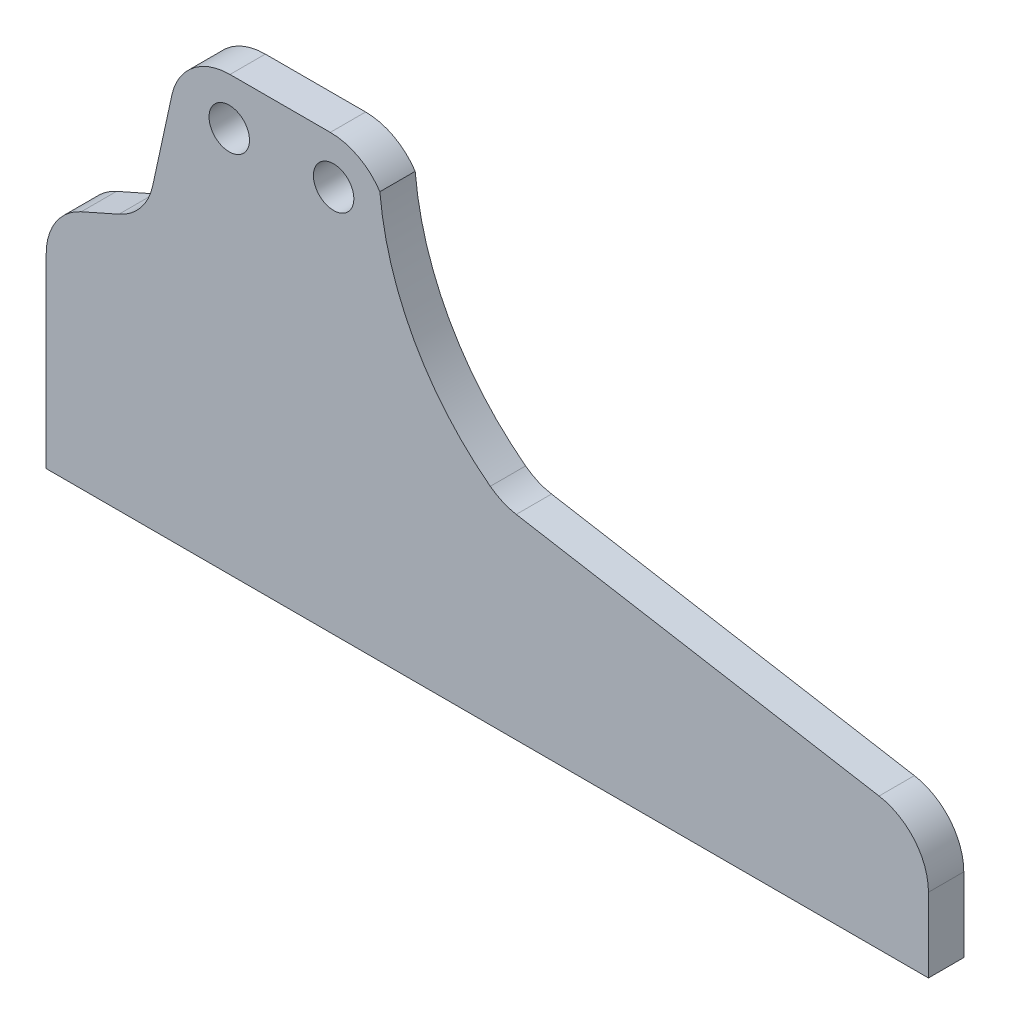
ISO-10303-21;
HEADER;
FILE_DESCRIPTION(('STEP AP214'),'2;1');
FILE_NAME('part.step','',(''),(''),'','','');
FILE_SCHEMA(('AUTOMOTIVE_DESIGN { 1 0 10303 214 1 1 1 1 }'));
ENDSEC;
DATA;
#1=APPLICATION_CONTEXT('core data for automotive mechanical design processes');
#2=APPLICATION_PROTOCOL_DEFINITION('international standard','automotive_design',2000,#1);
#3=PRODUCT_CONTEXT('',#1,'mechanical');
#4=PRODUCT('Part','Part','',(#3));
#5=PRODUCT_RELATED_PRODUCT_CATEGORY('part','',(#4));
#6=PRODUCT_DEFINITION_FORMATION('','',#4);
#7=PRODUCT_DEFINITION_CONTEXT('part definition',#1,'design');
#8=PRODUCT_DEFINITION('design','',#6,#7);
#9=PRODUCT_DEFINITION_SHAPE('','',#8);
#10=(LENGTH_UNIT() NAMED_UNIT(*) SI_UNIT(.MILLI.,.METRE.));
#11=(NAMED_UNIT(*) PLANE_ANGLE_UNIT() SI_UNIT($,.RADIAN.));
#12=(NAMED_UNIT(*) SI_UNIT($,.STERADIAN.) SOLID_ANGLE_UNIT());
#13=UNCERTAINTY_MEASURE_WITH_UNIT(LENGTH_MEASURE(1.E-05),#10,'distance_accuracy_value','');
#14=(GEOMETRIC_REPRESENTATION_CONTEXT(3) GLOBAL_UNCERTAINTY_ASSIGNED_CONTEXT((#13)) GLOBAL_UNIT_ASSIGNED_CONTEXT((#10,
#11,#12)) REPRESENTATION_CONTEXT('',''));
#15=CARTESIAN_POINT('',(0.,0.,0.));
#16=DIRECTION('',(0.,0.,1.));
#17=DIRECTION('',(1.,0.,0.));
#18=AXIS2_PLACEMENT_3D('',#15,#16,#17);
#19=CARTESIAN_POINT('',(-64.4109755332574,-10.7309621392567,5.99999999999999));
#20=DIRECTION('',(0.,0.,-1.));
#21=DIRECTION('',(-1.,0.,0.));
#22=AXIS2_PLACEMENT_3D('',#19,#20,#21);
#23=PLANE('',#22);
#24=DIRECTION('',(0.,1.,0.));
#25=VECTOR('',#24,1.);
#26=CARTESIAN_POINT('',(75.4762445355646,-29.743767833365,5.99999999999999));
#27=LINE('',#26,#25);
#28=CARTESIAN_POINT('',(75.4762445355646,-42.3626551440103,5.99999999999999));
#29=VERTEX_POINT('',#28);
#30=CARTESIAN_POINT('',(75.4762445355646,-29.743767833365,5.99999999999999));
#31=VERTEX_POINT('',#30);
#32=EDGE_CURVE('E193',#29,#31,#27,.T.);
#33=ORIENTED_EDGE('',*,*,#32,.T.);
#34=CARTESIAN_POINT('',(65.3686203518533,-29.743767833365,5.99999999999999));
#35=DIRECTION('',(0.,0.,1.));
#36=DIRECTION('',(-1.,0.,0.));
#37=AXIS2_PLACEMENT_3D('',#34,#35,#36);
#38=CIRCLE('',#37,10.1076241837114);
#39=CARTESIAN_POINT('',(67.0838116667973,-19.7827344837427,5.99999999999999));
#40=VERTEX_POINT('',#39);
#41=EDGE_CURVE('E111',#31,#40,#38,.T.);
#42=ORIENTED_EDGE('',*,*,#41,.T.);
#43=DIRECTION('',(-0.985497003902725,0.169692826303154,0.));
#44=VECTOR('',#43,1.);
#45=CARTESIAN_POINT('',(5.44351022759878,-9.16888489924571,5.99999999999999));
#46=LINE('',#45,#44);
#47=CARTESIAN_POINT('',(5.44351022759878,-9.16888489924571,5.99999999999999));
#48=VERTEX_POINT('',#47);
#49=EDGE_CURVE('E226',#40,#48,#46,.T.);
#50=ORIENTED_EDGE('',*,*,#49,.T.);
#51=CARTESIAN_POINT('',(7.15870154254287,0.792148450376581,5.99999999999999));
#52=DIRECTION('',(0.,0.,-1.));
#53=DIRECTION('',(1.,0.,0.));
#54=AXIS2_PLACEMENT_3D('',#51,#52,#53);
#55=CIRCLE('',#54,10.1076241837114);
#56=CARTESIAN_POINT('',(1.02946853054367,-7.24505064655802,5.99999999999999));
#57=VERTEX_POINT('',#56);
#58=EDGE_CURVE('E245',#48,#57,#55,.T.);
#59=ORIENTED_EDGE('',*,*,#58,.T.);
#60=CARTESIAN_POINT('',(30.2212864779,31.0338746912543,5.99999999999999));
#61=DIRECTION('',(0.,0.,-1.));
#62=DIRECTION('',(1.,0.,0.));
#63=AXIS2_PLACEMENT_3D('',#60,#61,#62);
#64=CIRCLE('',#63,48.1397793938589);
#65=CARTESIAN_POINT('',(-17.7251838120541,26.7240780807459,5.99999999999999));
#66=VERTEX_POINT('',#65);
#67=EDGE_CURVE('E242',#57,#66,#64,.T.);
#68=ORIENTED_EDGE('',*,*,#67,.T.);
#69=CARTESIAN_POINT('',(-26.1484310606989,21.1372209653951,5.99999999999999));
#70=DIRECTION('',(0.,0.,1.));
#71=DIRECTION('',(-1.,0.,0.));
#72=AXIS2_PLACEMENT_3D('',#69,#70,#71);
#73=CIRCLE('',#72,10.1076241837114);
#74=CARTESIAN_POINT('',(-26.1484310606989,31.2448451491065,5.99999999999999));
#75=VERTEX_POINT('',#74);
#76=EDGE_CURVE('E244',#66,#75,#73,.T.);
#77=ORIENTED_EDGE('',*,*,#76,.T.);
#78=DIRECTION('',(-1.,0.,0.));
#79=VECTOR('',#78,1.);
#80=CARTESIAN_POINT('',(-43.1863208249576,31.2448451491065,5.99999999999999));
#81=LINE('',#80,#79);
#82=CARTESIAN_POINT('',(-43.1863208249576,31.2448451491065,5.99999999999999));
#83=VERTEX_POINT('',#82);
#84=EDGE_CURVE('E247',#75,#83,#81,.T.);
#85=ORIENTED_EDGE('',*,*,#84,.T.);
#86=CARTESIAN_POINT('',(-43.1863208249577,21.1372209653951,5.99999999999999));
#87=DIRECTION('',(0.,0.,1.));
#88=DIRECTION('',(-1.,0.,0.));
#89=AXIS2_PLACEMENT_3D('',#86,#87,#88);
#90=CIRCLE('',#89,10.1076241837114);
#91=CARTESIAN_POINT('',(-53.0632522726949,23.2843799757727,5.99999999999999));
#92=VERTEX_POINT('',#91);
#93=EDGE_CURVE('E253',#83,#92,#90,.T.);
#94=ORIENTED_EDGE('',*,*,#93,.T.);
#95=DIRECTION('',(-0.212429644331044,-0.977176363922801,0.));
#96=VECTOR('',#95,1.);
#97=CARTESIAN_POINT('',(-56.3270893420715,8.27072945664082,5.99999999999999));
#98=LINE('',#97,#96);
#99=CARTESIAN_POINT('',(-56.3270893420715,8.27072945664081,5.99999999999999));
#100=VERTEX_POINT('',#99);
#101=EDGE_CURVE('E255',#92,#100,#98,.T.);
#102=ORIENTED_EDGE('',*,*,#101,.T.);
#103=CARTESIAN_POINT('',(-66.0988529812995,10.3950258999512,5.99999999999999));
#104=DIRECTION('',(0.,0.,-1.));
#105=DIRECTION('',(1.,0.,0.));
#106=AXIS2_PLACEMENT_3D('',#103,#104,#105);
#107=CIRCLE('',#106,10.);
#108=CARTESIAN_POINT('',(-62.049591398579,1.25153200348557,5.99999999999999));
#109=VERTEX_POINT('',#108);
#110=EDGE_CURVE('E257',#100,#109,#107,.T.);
#111=ORIENTED_EDGE('',*,*,#110,.T.);
#112=DIRECTION('',(-0.914349389646562,-0.404926158272049,0.));
#113=VECTOR('',#112,1.);
#114=CARTESIAN_POINT('',(-68.4602371159778,-1.58746824279103,5.99999999999999));
#115=LINE('',#114,#113);
#116=CARTESIAN_POINT('',(-68.4602371159778,-1.58746824279103,5.99999999999999));
#117=VERTEX_POINT('',#116);
#118=EDGE_CURVE('E148',#109,#117,#115,.T.);
#119=ORIENTED_EDGE('',*,*,#118,.T.);
#120=CARTESIAN_POINT('',(-64.4109755332574,-10.7309621392567,5.99999999999999));
#121=DIRECTION('',(0.,0.,1.));
#122=DIRECTION('',(-1.,0.,0.));
#123=AXIS2_PLACEMENT_3D('',#120,#121,#122);
#124=CIRCLE('',#123,10.);
#125=CARTESIAN_POINT('',(-74.4109755332574,-10.7309621392567,5.99999999999999));
#126=VERTEX_POINT('',#125);
#127=EDGE_CURVE('E142',#117,#126,#124,.T.);
#128=ORIENTED_EDGE('',*,*,#127,.T.);
#129=DIRECTION('',(0.,-1.,0.));
#130=VECTOR('',#129,1.);
#131=CARTESIAN_POINT('',(-74.4109755332574,-42.3626551440103,5.99999999999999));
#132=LINE('',#131,#130);
#133=CARTESIAN_POINT('',(-74.4109755332574,-42.3626551440103,5.99999999999999));
#134=VERTEX_POINT('',#133);
#135=EDGE_CURVE('E146',#126,#134,#132,.T.);
#136=ORIENTED_EDGE('',*,*,#135,.T.);
#137=DIRECTION('',(1.,0.,0.));
#138=VECTOR('',#137,1.);
#139=CARTESIAN_POINT('',(75.4762445355646,-42.3626551440103,5.99999999999999));
#140=LINE('',#139,#138);
#141=EDGE_CURVE('E50',#134,#29,#140,.T.);
#142=ORIENTED_EDGE('',*,*,#141,.T.);
#143=EDGE_LOOP('',(#33,#42,#50,#59,#68,#77,#85,#94,#102,#111,#119,#128,#136,#142));
#144=FACE_BOUND('',#143,.T.);
#145=CARTESIAN_POINT('',(-25.5822377150512,23.471115745213,5.99999999999999));
#146=DIRECTION('',(0.,0.,1.));
#147=DIRECTION('',(1.,0.,0.));
#148=AXIS2_PLACEMENT_3D('',#145,#146,#147);
#149=CIRCLE('',#148,3.43553548537648);
#150=CARTESIAN_POINT('',(-22.1467022296747,23.471115745213,5.99999999999999));
#151=VERTEX_POINT('',#150);
#152=EDGE_CURVE('E170',#151,#151,#149,.T.);
#153=ORIENTED_EDGE('',*,*,#152,.F.);
#154=EDGE_LOOP('',(#153));
#155=FACE_BOUND('',#154,.T.);
#156=CARTESIAN_POINT('',(-43.3160579176833,23.2281867013413,5.99999999999999));
#157=DIRECTION('',(0.,0.,1.));
#158=DIRECTION('',(1.,0.,0.));
#159=AXIS2_PLACEMENT_3D('',#156,#157,#158);
#160=CIRCLE('',#159,3.43553548537648);
#161=CARTESIAN_POINT('',(-39.8805224323068,23.2281867013413,5.99999999999999));
#162=VERTEX_POINT('',#161);
#163=EDGE_CURVE('E298',#162,#162,#160,.T.);
#164=ORIENTED_EDGE('',*,*,#163,.F.);
#165=EDGE_LOOP('',(#164));
#166=FACE_BOUND('',#165,.T.);
#167=ADVANCED_FACE('F33',(#144,#155,#166),#23,.F.);
#168=CARTESIAN_POINT('',(-64.4109755332574,-10.7309621392567,0.));
#169=DIRECTION('',(0.,0.,-1.));
#170=DIRECTION('',(-1.,0.,0.));
#171=AXIS2_PLACEMENT_3D('',#168,#169,#170);
#172=PLANE('',#171);
#173=CARTESIAN_POINT('',(-25.5822377150512,23.471115745213,0.));
#174=DIRECTION('',(0.,0.,1.));
#175=DIRECTION('',(1.,0.,0.));
#176=AXIS2_PLACEMENT_3D('',#173,#174,#175);
#177=CIRCLE('',#176,3.43553548537648);
#178=CARTESIAN_POINT('',(-22.1467022296747,23.471115745213,0.));
#179=VERTEX_POINT('',#178);
#180=EDGE_CURVE('E303',#179,#179,#177,.T.);
#181=ORIENTED_EDGE('',*,*,#180,.T.);
#182=EDGE_LOOP('',(#181));
#183=FACE_BOUND('',#182,.T.);
#184=DIRECTION('',(0.,1.,0.));
#185=VECTOR('',#184,1.);
#186=CARTESIAN_POINT('',(75.4762445355646,-29.743767833365,0.));
#187=LINE('',#186,#185);
#188=CARTESIAN_POINT('',(75.4762445355646,-42.3626551440103,0.));
#189=VERTEX_POINT('',#188);
#190=CARTESIAN_POINT('',(75.4762445355646,-29.743767833365,0.));
#191=VERTEX_POINT('',#190);
#192=EDGE_CURVE('E166',#189,#191,#187,.T.);
#193=ORIENTED_EDGE('',*,*,#192,.F.);
#194=DIRECTION('',(1.,0.,0.));
#195=VECTOR('',#194,1.);
#196=CARTESIAN_POINT('',(75.4762445355646,-42.3626551440103,0.));
#197=LINE('',#196,#195);
#198=CARTESIAN_POINT('',(-74.4109755332574,-42.3626551440103,0.));
#199=VERTEX_POINT('',#198);
#200=EDGE_CURVE('E103',#199,#189,#197,.T.);
#201=ORIENTED_EDGE('',*,*,#200,.F.);
#202=DIRECTION('',(0.,-1.,0.));
#203=VECTOR('',#202,1.);
#204=CARTESIAN_POINT('',(-74.4109755332574,-42.3626551440103,0.));
#205=LINE('',#204,#203);
#206=CARTESIAN_POINT('',(-74.4109755332574,-10.7309621392567,0.));
#207=VERTEX_POINT('',#206);
#208=EDGE_CURVE('E97',#207,#199,#205,.T.);
#209=ORIENTED_EDGE('',*,*,#208,.F.);
#210=CARTESIAN_POINT('',(-64.4109755332574,-10.7309621392567,0.));
#211=DIRECTION('',(0.,0.,1.));
#212=DIRECTION('',(-1.,0.,0.));
#213=AXIS2_PLACEMENT_3D('',#210,#211,#212);
#214=CIRCLE('',#213,10.);
#215=CARTESIAN_POINT('',(-68.4602371159778,-1.58746824279103,0.));
#216=VERTEX_POINT('',#215);
#217=EDGE_CURVE('E156',#216,#207,#214,.T.);
#218=ORIENTED_EDGE('',*,*,#217,.F.);
#219=DIRECTION('',(-0.914349389646562,-0.404926158272049,0.));
#220=VECTOR('',#219,1.);
#221=CARTESIAN_POINT('',(-68.4602371159778,-1.58746824279103,0.));
#222=LINE('',#221,#220);
#223=CARTESIAN_POINT('',(-62.049591398579,1.25153200348557,0.));
#224=VERTEX_POINT('',#223);
#225=EDGE_CURVE('E188',#224,#216,#222,.T.);
#226=ORIENTED_EDGE('',*,*,#225,.F.);
#227=CARTESIAN_POINT('',(-66.0988529812995,10.3950258999512,0.));
#228=DIRECTION('',(0.,0.,-1.));
#229=DIRECTION('',(1.,0.,0.));
#230=AXIS2_PLACEMENT_3D('',#227,#228,#229);
#231=CIRCLE('',#230,10.);
#232=CARTESIAN_POINT('',(-56.3270893420715,8.27072945664081,0.));
#233=VERTEX_POINT('',#232);
#234=EDGE_CURVE('E186',#233,#224,#231,.T.);
#235=ORIENTED_EDGE('',*,*,#234,.F.);
#236=DIRECTION('',(-0.212429644331044,-0.977176363922801,0.));
#237=VECTOR('',#236,1.);
#238=CARTESIAN_POINT('',(-56.3270893420715,8.27072945664082,0.));
#239=LINE('',#238,#237);
#240=CARTESIAN_POINT('',(-53.0632522726949,23.2843799757727,0.));
#241=VERTEX_POINT('',#240);
#242=EDGE_CURVE('E184',#241,#233,#239,.T.);
#243=ORIENTED_EDGE('',*,*,#242,.F.);
#244=CARTESIAN_POINT('',(-43.1863208249577,21.1372209653951,0.));
#245=DIRECTION('',(0.,0.,1.));
#246=DIRECTION('',(-1.,0.,0.));
#247=AXIS2_PLACEMENT_3D('',#244,#245,#246);
#248=CIRCLE('',#247,10.1076241837114);
#249=CARTESIAN_POINT('',(-43.1863208249576,31.2448451491065,0.));
#250=VERTEX_POINT('',#249);
#251=EDGE_CURVE('E182',#250,#241,#248,.T.);
#252=ORIENTED_EDGE('',*,*,#251,.F.);
#253=DIRECTION('',(-1.,0.,0.));
#254=VECTOR('',#253,1.);
#255=CARTESIAN_POINT('',(-43.1863208249576,31.2448451491065,0.));
#256=LINE('',#255,#254);
#257=CARTESIAN_POINT('',(-26.1484310606989,31.2448451491065,0.));
#258=VERTEX_POINT('',#257);
#259=EDGE_CURVE('E180',#258,#250,#256,.T.);
#260=ORIENTED_EDGE('',*,*,#259,.F.);
#261=CARTESIAN_POINT('',(-26.1484310606989,21.1372209653951,0.));
#262=DIRECTION('',(0.,0.,1.));
#263=DIRECTION('',(-1.,0.,0.));
#264=AXIS2_PLACEMENT_3D('',#261,#262,#263);
#265=CIRCLE('',#264,10.1076241837114);
#266=CARTESIAN_POINT('',(-17.7251838120541,26.7240780807459,0.));
#267=VERTEX_POINT('',#266);
#268=EDGE_CURVE('E178',#267,#258,#265,.T.);
#269=ORIENTED_EDGE('',*,*,#268,.F.);
#270=CARTESIAN_POINT('',(30.2212864779,31.0338746912543,0.));
#271=DIRECTION('',(0.,0.,-1.));
#272=DIRECTION('',(1.,0.,0.));
#273=AXIS2_PLACEMENT_3D('',#270,#271,#272);
#274=CIRCLE('',#273,48.1397793938589);
#275=CARTESIAN_POINT('',(1.02946853054367,-7.24505064655802,0.));
#276=VERTEX_POINT('',#275);
#277=EDGE_CURVE('E176',#276,#267,#274,.T.);
#278=ORIENTED_EDGE('',*,*,#277,.F.);
#279=CARTESIAN_POINT('',(7.15870154254287,0.792148450376581,0.));
#280=DIRECTION('',(0.,0.,-1.));
#281=DIRECTION('',(1.,0.,0.));
#282=AXIS2_PLACEMENT_3D('',#279,#280,#281);
#283=CIRCLE('',#282,10.1076241837114);
#284=CARTESIAN_POINT('',(5.44351022759878,-9.16888489924571,0.));
#285=VERTEX_POINT('',#284);
#286=EDGE_CURVE('E174',#285,#276,#283,.T.);
#287=ORIENTED_EDGE('',*,*,#286,.F.);
#288=DIRECTION('',(-0.985497003902725,0.169692826303154,0.));
#289=VECTOR('',#288,1.);
#290=CARTESIAN_POINT('',(5.44351022759878,-9.16888489924571,0.));
#291=LINE('',#290,#289);
#292=CARTESIAN_POINT('',(67.0838116667973,-19.7827344837427,0.));
#293=VERTEX_POINT('',#292);
#294=EDGE_CURVE('E172',#293,#285,#291,.T.);
#295=ORIENTED_EDGE('',*,*,#294,.F.);
#296=CARTESIAN_POINT('',(65.3686203518533,-29.743767833365,0.));
#297=DIRECTION('',(0.,0.,1.));
#298=DIRECTION('',(-1.,0.,0.));
#299=AXIS2_PLACEMENT_3D('',#296,#297,#298);
#300=CIRCLE('',#299,10.1076241837114);
#301=EDGE_CURVE('E169',#191,#293,#300,.T.);
#302=ORIENTED_EDGE('',*,*,#301,.F.);
#303=EDGE_LOOP('',(#193,#201,#209,#218,#226,#235,#243,#252,#260,#269,#278,#287,#295,#302));
#304=FACE_BOUND('',#303,.T.);
#305=CARTESIAN_POINT('',(-43.3160579176833,23.2281867013413,0.));
#306=DIRECTION('',(0.,0.,1.));
#307=DIRECTION('',(1.,0.,0.));
#308=AXIS2_PLACEMENT_3D('',#305,#306,#307);
#309=CIRCLE('',#308,3.43553548537648);
#310=CARTESIAN_POINT('',(-39.8805224323068,23.2281867013413,0.));
#311=VERTEX_POINT('',#310);
#312=EDGE_CURVE('E301',#311,#311,#309,.T.);
#313=ORIENTED_EDGE('',*,*,#312,.T.);
#314=EDGE_LOOP('',(#313));
#315=FACE_BOUND('',#314,.T.);
#316=ADVANCED_FACE('F230',(#183,#304,#315),#172,.T.);
#317=CARTESIAN_POINT('',(75.4762445355646,-29.743767833365,5.99999999999999));
#318=DIRECTION('',(-1.,0.,0.));
#319=DIRECTION('',(0.,0.,1.));
#320=AXIS2_PLACEMENT_3D('',#317,#318,#319);
#321=PLANE('',#320);
#322=ORIENTED_EDGE('',*,*,#192,.T.);
#323=DIRECTION('',(0.,0.,-1.));
#324=VECTOR('',#323,1.);
#325=CARTESIAN_POINT('',(75.4762445355646,-29.743767833365,5.99999999999999));
#326=LINE('',#325,#324);
#327=EDGE_CURVE('E11',#31,#191,#326,.T.);
#328=ORIENTED_EDGE('',*,*,#327,.F.);
#329=ORIENTED_EDGE('',*,*,#32,.F.);
#330=DIRECTION('',(0.,0.,-1.));
#331=VECTOR('',#330,1.);
#332=CARTESIAN_POINT('',(75.4762445355646,-42.3626551440103,5.99999999999999));
#333=LINE('',#332,#331);
#334=EDGE_CURVE('E162',#29,#189,#333,.T.);
#335=ORIENTED_EDGE('',*,*,#334,.T.);
#336=EDGE_LOOP('',(#322,#328,#329,#335));
#337=FACE_BOUND('',#336,.T.);
#338=ADVANCED_FACE('F35',(#337),#321,.F.);
#339=CARTESIAN_POINT('',(65.3686203518533,-29.743767833365,5.99999999999999));
#340=DIRECTION('',(0.,0.,-1.));
#341=DIRECTION('',(-1.,0.,0.));
#342=AXIS2_PLACEMENT_3D('',#339,#340,#341);
#343=CYLINDRICAL_SURFACE('',#342,10.1076241837114);
#344=ORIENTED_EDGE('',*,*,#301,.T.);
#345=DIRECTION('',(0.,0.,-1.));
#346=VECTOR('',#345,1.);
#347=CARTESIAN_POINT('',(67.0838116667973,-19.7827344837427,5.99999999999999));
#348=LINE('',#347,#346);
#349=EDGE_CURVE('E42',#40,#293,#348,.T.);
#350=ORIENTED_EDGE('',*,*,#349,.F.);
#351=ORIENTED_EDGE('',*,*,#41,.F.);
#352=ORIENTED_EDGE('',*,*,#327,.T.);
#353=EDGE_LOOP('',(#344,#350,#351,#352));
#354=FACE_BOUND('',#353,.T.);
#355=ADVANCED_FACE('F418',(#354),#343,.T.);
#356=CARTESIAN_POINT('',(5.44351022759878,-9.16888489924571,5.99999999999999));
#357=DIRECTION('',(-0.169692826303154,-0.985497003902725,0.));
#358=DIRECTION('',(0.985497003902725,-0.169692826303154,0.));
#359=AXIS2_PLACEMENT_3D('',#356,#357,#358);
#360=PLANE('',#359);
#361=ORIENTED_EDGE('',*,*,#294,.T.);
#362=DIRECTION('',(0.,0.,-1.));
#363=VECTOR('',#362,1.);
#364=CARTESIAN_POINT('',(5.44351022759878,-9.16888489924571,5.99999999999999));
#365=LINE('',#364,#363);
#366=EDGE_CURVE('E218',#48,#285,#365,.T.);
#367=ORIENTED_EDGE('',*,*,#366,.F.);
#368=ORIENTED_EDGE('',*,*,#49,.F.);
#369=ORIENTED_EDGE('',*,*,#349,.T.);
#370=EDGE_LOOP('',(#361,#367,#368,#369));
#371=FACE_BOUND('',#370,.T.);
#372=ADVANCED_FACE('F224',(#371),#360,.F.);
#373=CARTESIAN_POINT('',(7.15870154254287,0.792148450376581,5.99999999999999));
#374=DIRECTION('',(0.,0.,-1.));
#375=DIRECTION('',(-1.,0.,0.));
#376=AXIS2_PLACEMENT_3D('',#373,#374,#375);
#377=CYLINDRICAL_SURFACE('',#376,10.1076241837114);
#378=ORIENTED_EDGE('',*,*,#286,.T.);
#379=DIRECTION('',(0.,0.,-1.));
#380=VECTOR('',#379,1.);
#381=CARTESIAN_POINT('',(1.02946853054367,-7.24505064655802,5.99999999999999));
#382=LINE('',#381,#380);
#383=EDGE_CURVE('E215',#57,#276,#382,.T.);
#384=ORIENTED_EDGE('',*,*,#383,.F.);
#385=ORIENTED_EDGE('',*,*,#58,.F.);
#386=ORIENTED_EDGE('',*,*,#366,.T.);
#387=EDGE_LOOP('',(#378,#384,#385,#386));
#388=FACE_BOUND('',#387,.T.);
#389=ADVANCED_FACE('F236',(#388),#377,.F.);
#390=CARTESIAN_POINT('',(30.2212864779,31.0338746912543,5.99999999999999));
#391=DIRECTION('',(0.,0.,-1.));
#392=DIRECTION('',(-1.,0.,0.));
#393=AXIS2_PLACEMENT_3D('',#390,#391,#392);
#394=CYLINDRICAL_SURFACE('',#393,48.1397793938589);
#395=ORIENTED_EDGE('',*,*,#277,.T.);
#396=DIRECTION('',(0.,0.,-1.));
#397=VECTOR('',#396,1.);
#398=CARTESIAN_POINT('',(-17.7251838120541,26.7240780807459,5.99999999999999));
#399=LINE('',#398,#397);
#400=EDGE_CURVE('E212',#66,#267,#399,.T.);
#401=ORIENTED_EDGE('',*,*,#400,.F.);
#402=ORIENTED_EDGE('',*,*,#67,.F.);
#403=ORIENTED_EDGE('',*,*,#383,.T.);
#404=EDGE_LOOP('',(#395,#401,#402,#403));
#405=FACE_BOUND('',#404,.T.);
#406=ADVANCED_FACE('F240',(#405),#394,.F.);
#407=CARTESIAN_POINT('',(-26.1484310606989,21.1372209653951,5.99999999999999));
#408=DIRECTION('',(0.,0.,-1.));
#409=DIRECTION('',(-1.,0.,0.));
#410=AXIS2_PLACEMENT_3D('',#407,#408,#409);
#411=CYLINDRICAL_SURFACE('',#410,10.1076241837114);
#412=ORIENTED_EDGE('',*,*,#268,.T.);
#413=DIRECTION('',(0.,0.,-1.));
#414=VECTOR('',#413,1.);
#415=CARTESIAN_POINT('',(-26.1484310606989,31.2448451491065,5.99999999999999));
#416=LINE('',#415,#414);
#417=EDGE_CURVE('E209',#75,#258,#416,.T.);
#418=ORIENTED_EDGE('',*,*,#417,.F.);
#419=ORIENTED_EDGE('',*,*,#76,.F.);
#420=ORIENTED_EDGE('',*,*,#400,.T.);
#421=EDGE_LOOP('',(#412,#418,#419,#420));
#422=FACE_BOUND('',#421,.T.);
#423=ADVANCED_FACE('F383',(#422),#411,.T.);
#424=CARTESIAN_POINT('',(-43.1863208249576,31.2448451491065,5.99999999999999));
#425=DIRECTION('',(0.,-1.,0.));
#426=DIRECTION('',(0.,0.,-1.));
#427=AXIS2_PLACEMENT_3D('',#424,#425,#426);
#428=PLANE('',#427);
#429=ORIENTED_EDGE('',*,*,#259,.T.);
#430=DIRECTION('',(0.,0.,-1.));
#431=VECTOR('',#430,1.);
#432=CARTESIAN_POINT('',(-43.1863208249576,31.2448451491065,5.99999999999999));
#433=LINE('',#432,#431);
#434=EDGE_CURVE('E206',#83,#250,#433,.T.);
#435=ORIENTED_EDGE('',*,*,#434,.F.);
#436=ORIENTED_EDGE('',*,*,#84,.F.);
#437=ORIENTED_EDGE('',*,*,#417,.T.);
#438=EDGE_LOOP('',(#429,#435,#436,#437));
#439=FACE_BOUND('',#438,.T.);
#440=ADVANCED_FACE('F373',(#439),#428,.F.);
#441=CARTESIAN_POINT('',(-43.1863208249577,21.1372209653951,5.99999999999999));
#442=DIRECTION('',(0.,0.,-1.));
#443=DIRECTION('',(-1.,0.,0.));
#444=AXIS2_PLACEMENT_3D('',#441,#442,#443);
#445=CYLINDRICAL_SURFACE('',#444,10.1076241837114);
#446=ORIENTED_EDGE('',*,*,#251,.T.);
#447=DIRECTION('',(0.,0.,-1.));
#448=VECTOR('',#447,1.);
#449=CARTESIAN_POINT('',(-53.0632522726949,23.2843799757727,5.99999999999999));
#450=LINE('',#449,#448);
#451=EDGE_CURVE('E203',#92,#241,#450,.T.);
#452=ORIENTED_EDGE('',*,*,#451,.F.);
#453=ORIENTED_EDGE('',*,*,#93,.F.);
#454=ORIENTED_EDGE('',*,*,#434,.T.);
#455=EDGE_LOOP('',(#446,#452,#453,#454));
#456=FACE_BOUND('',#455,.T.);
#457=ADVANCED_FACE('F363',(#456),#445,.T.);
#458=CARTESIAN_POINT('',(-56.3270893420715,8.27072945664082,5.99999999999999));
#459=DIRECTION('',(0.977176363922801,-0.212429644331044,0.));
#460=DIRECTION('',(0.212429644331044,0.977176363922801,0.));
#461=AXIS2_PLACEMENT_3D('',#458,#459,#460);
#462=PLANE('',#461);
#463=ORIENTED_EDGE('',*,*,#242,.T.);
#464=DIRECTION('',(0.,0.,-1.));
#465=VECTOR('',#464,1.);
#466=CARTESIAN_POINT('',(-56.3270893420715,8.27072945664081,5.99999999999999));
#467=LINE('',#466,#465);
#468=EDGE_CURVE('E200',#100,#233,#467,.T.);
#469=ORIENTED_EDGE('',*,*,#468,.F.);
#470=ORIENTED_EDGE('',*,*,#101,.F.);
#471=ORIENTED_EDGE('',*,*,#451,.T.);
#472=EDGE_LOOP('',(#463,#469,#470,#471));
#473=FACE_BOUND('',#472,.T.);
#474=ADVANCED_FACE('F354',(#473),#462,.F.);
#475=CARTESIAN_POINT('',(-66.0988529812995,10.3950258999512,5.99999999999999));
#476=DIRECTION('',(0.,0.,-1.));
#477=DIRECTION('',(-1.,0.,0.));
#478=AXIS2_PLACEMENT_3D('',#475,#476,#477);
#479=CYLINDRICAL_SURFACE('',#478,10.);
#480=ORIENTED_EDGE('',*,*,#234,.T.);
#481=DIRECTION('',(0.,0.,-1.));
#482=VECTOR('',#481,1.);
#483=CARTESIAN_POINT('',(-62.049591398579,1.25153200348557,5.99999999999999));
#484=LINE('',#483,#482);
#485=EDGE_CURVE('E197',#109,#224,#484,.T.);
#486=ORIENTED_EDGE('',*,*,#485,.F.);
#487=ORIENTED_EDGE('',*,*,#110,.F.);
#488=ORIENTED_EDGE('',*,*,#468,.T.);
#489=EDGE_LOOP('',(#480,#486,#487,#488));
#490=FACE_BOUND('',#489,.T.);
#491=ADVANCED_FACE('F263',(#490),#479,.F.);
#492=CARTESIAN_POINT('',(-68.4602371159778,-1.58746824279103,5.99999999999999));
#493=DIRECTION('',(0.404926158272049,-0.914349389646562,0.));
#494=DIRECTION('',(0.914349389646562,0.404926158272049,0.));
#495=AXIS2_PLACEMENT_3D('',#492,#493,#494);
#496=PLANE('',#495);
#497=ORIENTED_EDGE('',*,*,#225,.T.);
#498=DIRECTION('',(0.,0.,-1.));
#499=VECTOR('',#498,1.);
#500=CARTESIAN_POINT('',(-68.4602371159778,-1.58746824279103,5.99999999999999));
#501=LINE('',#500,#499);
#502=EDGE_CURVE('E157',#117,#216,#501,.T.);
#503=ORIENTED_EDGE('',*,*,#502,.F.);
#504=ORIENTED_EDGE('',*,*,#118,.F.);
#505=ORIENTED_EDGE('',*,*,#485,.T.);
#506=EDGE_LOOP('',(#497,#503,#504,#505));
#507=FACE_BOUND('',#506,.T.);
#508=ADVANCED_FACE('F267',(#507),#496,.F.);
#509=CARTESIAN_POINT('',(-64.4109755332574,-10.7309621392567,5.99999999999999));
#510=DIRECTION('',(0.,0.,-1.));
#511=DIRECTION('',(-1.,0.,0.));
#512=AXIS2_PLACEMENT_3D('',#509,#510,#511);
#513=CYLINDRICAL_SURFACE('',#512,10.);
#514=ORIENTED_EDGE('',*,*,#217,.T.);
#515=DIRECTION('',(0.,0.,-1.));
#516=VECTOR('',#515,1.);
#517=CARTESIAN_POINT('',(-74.4109755332574,-10.7309621392567,5.99999999999999));
#518=LINE('',#517,#516);
#519=EDGE_CURVE('E153',#126,#207,#518,.T.);
#520=ORIENTED_EDGE('',*,*,#519,.F.);
#521=ORIENTED_EDGE('',*,*,#127,.F.);
#522=ORIENTED_EDGE('',*,*,#502,.T.);
#523=EDGE_LOOP('',(#514,#520,#521,#522));
#524=FACE_BOUND('',#523,.T.);
#525=ADVANCED_FACE('F154',(#524),#513,.T.);
#526=CARTESIAN_POINT('',(-74.4109755332574,-42.3626551440103,5.99999999999999));
#527=DIRECTION('',(1.,0.,0.));
#528=DIRECTION('',(0.,0.,-1.));
#529=AXIS2_PLACEMENT_3D('',#526,#527,#528);
#530=PLANE('',#529);
#531=ORIENTED_EDGE('',*,*,#208,.T.);
#532=DIRECTION('',(0.,0.,-1.));
#533=VECTOR('',#532,1.);
#534=CARTESIAN_POINT('',(-74.4109755332574,-42.3626551440103,5.99999999999999));
#535=LINE('',#534,#533);
#536=EDGE_CURVE('E158',#134,#199,#535,.T.);
#537=ORIENTED_EDGE('',*,*,#536,.F.);
#538=ORIENTED_EDGE('',*,*,#135,.F.);
#539=ORIENTED_EDGE('',*,*,#519,.T.);
#540=EDGE_LOOP('',(#531,#537,#538,#539));
#541=FACE_BOUND('',#540,.T.);
#542=ADVANCED_FACE('F160',(#541),#530,.F.);
#543=CARTESIAN_POINT('',(75.4762445355646,-42.3626551440103,5.99999999999999));
#544=DIRECTION('',(0.,1.,0.));
#545=DIRECTION('',(0.,0.,1.));
#546=AXIS2_PLACEMENT_3D('',#543,#544,#545);
#547=PLANE('',#546);
#548=ORIENTED_EDGE('',*,*,#200,.T.);
#549=ORIENTED_EDGE('',*,*,#334,.F.);
#550=ORIENTED_EDGE('',*,*,#141,.F.);
#551=ORIENTED_EDGE('',*,*,#536,.T.);
#552=EDGE_LOOP('',(#548,#549,#550,#551));
#553=FACE_BOUND('',#552,.T.);
#554=ADVANCED_FACE('F271',(#553),#547,.F.);
#555=CARTESIAN_POINT('',(-25.5822377150512,23.471115745213,5.99999999999999));
#556=DIRECTION('',(0.,0.,-1.));
#557=DIRECTION('',(-1.,0.,0.));
#558=AXIS2_PLACEMENT_3D('',#555,#556,#557);
#559=CYLINDRICAL_SURFACE('',#558,3.43553548537648);
#560=ORIENTED_EDGE('',*,*,#152,.T.);
#561=EDGE_LOOP('',(#560));
#562=FACE_BOUND('',#561,.T.);
#563=ORIENTED_EDGE('',*,*,#180,.F.);
#564=EDGE_LOOP('',(#563));
#565=FACE_BOUND('',#564,.T.);
#566=ADVANCED_FACE('F273',(#562,#565),#559,.F.);
#567=CARTESIAN_POINT('',(-43.3160579176833,23.2281867013413,5.99999999999999));
#568=DIRECTION('',(0.,0.,-1.));
#569=DIRECTION('',(-1.,0.,0.));
#570=AXIS2_PLACEMENT_3D('',#567,#568,#569);
#571=CYLINDRICAL_SURFACE('',#570,3.43553548537648);
#572=ORIENTED_EDGE('',*,*,#163,.T.);
#573=EDGE_LOOP('',(#572));
#574=FACE_BOUND('',#573,.T.);
#575=ORIENTED_EDGE('',*,*,#312,.F.);
#576=EDGE_LOOP('',(#575));
#577=FACE_BOUND('',#576,.T.);
#578=ADVANCED_FACE('F279',(#574,#577),#571,.F.);
#579=CLOSED_SHELL('',(#167,#316,#338,#355,#372,#389,#406,#423,#440,#457,#474,#491,#508,#525,
#542,#554,#566,#578));
#580=MANIFOLD_SOLID_BREP('B2',#579);
#581=ADVANCED_BREP_SHAPE_REPRESENTATION('',(#18,#580),#14);
#582=SHAPE_DEFINITION_REPRESENTATION(#9,#581);
ENDSEC;
END-ISO-10303-21;
